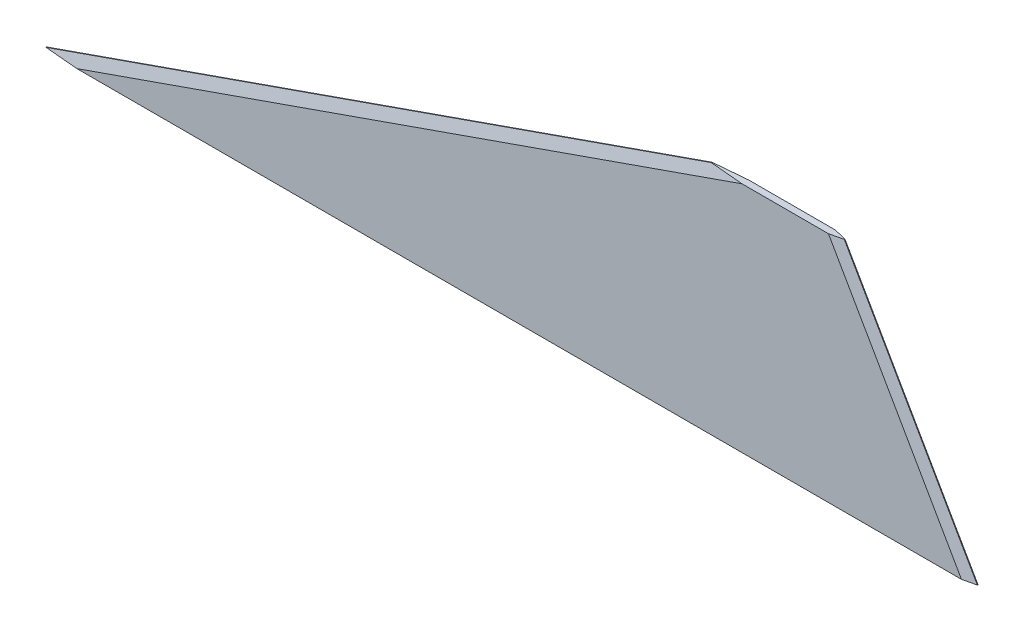
ISO-10303-21;
HEADER;
FILE_DESCRIPTION(('STEP AP214'),'2;1');
FILE_NAME('part.step','',(''),(''),'','','');
FILE_SCHEMA(('AUTOMOTIVE_DESIGN { 1 0 10303 214 1 1 1 1 }'));
ENDSEC;
DATA;
#1=APPLICATION_CONTEXT('core data for automotive mechanical design processes');
#2=APPLICATION_PROTOCOL_DEFINITION('international standard','automotive_design',2000,#1);
#3=PRODUCT_CONTEXT('',#1,'mechanical');
#4=PRODUCT('Part','Part','',(#3));
#5=PRODUCT_RELATED_PRODUCT_CATEGORY('part','',(#4));
#6=PRODUCT_DEFINITION_FORMATION('','',#4);
#7=PRODUCT_DEFINITION_CONTEXT('part definition',#1,'design');
#8=PRODUCT_DEFINITION('design','',#6,#7);
#9=PRODUCT_DEFINITION_SHAPE('','',#8);
#10=(LENGTH_UNIT() NAMED_UNIT(*) SI_UNIT(.MILLI.,.METRE.));
#11=(NAMED_UNIT(*) PLANE_ANGLE_UNIT() SI_UNIT($,.RADIAN.));
#12=(NAMED_UNIT(*) SI_UNIT($,.STERADIAN.) SOLID_ANGLE_UNIT());
#13=UNCERTAINTY_MEASURE_WITH_UNIT(LENGTH_MEASURE(1.E-05),#10,'distance_accuracy_value','');
#14=(GEOMETRIC_REPRESENTATION_CONTEXT(3) GLOBAL_UNCERTAINTY_ASSIGNED_CONTEXT((#13)) GLOBAL_UNIT_ASSIGNED_CONTEXT((#10,
#11,#12)) REPRESENTATION_CONTEXT('',''));
#15=CARTESIAN_POINT('',(0.,0.,0.));
#16=DIRECTION('',(0.,0.,1.));
#17=DIRECTION('',(1.,0.,0.));
#18=AXIS2_PLACEMENT_3D('',#15,#16,#17);
#19=CARTESIAN_POINT('',(254.,88.9,2.54));
#20=DIRECTION('',(0.330350424728106,-0.943858356366018,0.));
#21=DIRECTION('',(0.943858356366017,0.330350424728106,0.));
#22=AXIS2_PLACEMENT_3D('',#19,#20,#21);
#23=PLANE('',#22);
#24=DIRECTION('',(0.,0.,-1.));
#25=VECTOR('',#24,1.);
#26=CARTESIAN_POINT('',(254.,88.9,2.54));
#27=LINE('',#26,#25);
#28=CARTESIAN_POINT('',(254.,88.9,1.39699999999997));
#29=VERTEX_POINT('',#28);
#30=CARTESIAN_POINT('',(254.,88.9,1.14300000000002));
#31=VERTEX_POINT('',#30);
#32=EDGE_CURVE('E144',#29,#31,#27,.T.);
#33=ORIENTED_EDGE('',*,*,#32,.T.);
#34=DIRECTION('',(-0.943858356366017,-0.330350424728106,0.));
#35=VECTOR('',#34,1.);
#36=CARTESIAN_POINT('',(0.,0.,1.14300000000002));
#37=LINE('',#36,#35);
#38=CARTESIAN_POINT('',(0.,0.,1.14300000000002));
#39=VERTEX_POINT('',#38);
#40=EDGE_CURVE('E11',#31,#39,#37,.T.);
#41=ORIENTED_EDGE('',*,*,#40,.T.);
#42=DIRECTION('',(0.,0.,-1.));
#43=VECTOR('',#42,1.);
#44=CARTESIAN_POINT('',(0.,0.,2.54));
#45=LINE('',#44,#43);
#46=CARTESIAN_POINT('',(0.,0.,1.39699999999998));
#47=VERTEX_POINT('',#46);
#48=EDGE_CURVE('E132',#47,#39,#45,.T.);
#49=ORIENTED_EDGE('',*,*,#48,.F.);
#50=DIRECTION('',(0.943858356366017,0.330350424728106,0.));
#51=VECTOR('',#50,1.);
#52=CARTESIAN_POINT('',(254.,88.9,1.39699999999998));
#53=LINE('',#52,#51);
#54=EDGE_CURVE('E50',#47,#29,#53,.T.);
#55=ORIENTED_EDGE('',*,*,#54,.T.);
#56=EDGE_LOOP('',(#33,#41,#49,#55));
#57=FACE_BOUND('',#56,.T.);
#58=ADVANCED_FACE('F41',(#57),#23,.F.);
#59=CARTESIAN_POINT('',(0.,0.,2.54));
#60=DIRECTION('',(0.,1.,0.));
#61=DIRECTION('',(0.,0.,1.));
#62=AXIS2_PLACEMENT_3D('',#59,#60,#61);
#63=PLANE('',#62);
#64=DIRECTION('',(0.,0.,-1.));
#65=VECTOR('',#64,1.);
#66=CARTESIAN_POINT('',(355.6,0.,2.54));
#67=LINE('',#66,#65);
#68=CARTESIAN_POINT('',(355.6,0.,1.39700000000001));
#69=VERTEX_POINT('',#68);
#70=CARTESIAN_POINT('',(355.6,0.,1.14299999999999));
#71=VERTEX_POINT('',#70);
#72=EDGE_CURVE('E160',#69,#71,#67,.T.);
#73=ORIENTED_EDGE('',*,*,#72,.F.);
#74=DIRECTION('',(0.973989348035412,0.,-0.226593799371369));
#75=VECTOR('',#74,1.);
#76=CARTESIAN_POINT('',(268.796227621545,0.,21.5914678580679));
#77=LINE('',#76,#75);
#78=CARTESIAN_POINT('',(350.686936059624,0.,2.53999999999994));
#79=VERTEX_POINT('',#78);
#80=EDGE_CURVE('E137',#69,#79,#77,.F.);
#81=ORIENTED_EDGE('',*,*,#80,.T.);
#82=DIRECTION('',(1.,0.,0.));
#83=VECTOR('',#82,1.);
#84=CARTESIAN_POINT('',(0.,0.,2.54));
#85=LINE('',#84,#83);
#86=CARTESIAN_POINT('',(12.9127549224802,0.,2.54));
#87=VERTEX_POINT('',#86);
#88=EDGE_CURVE('E126',#87,#79,#85,.T.);
#89=ORIENTED_EDGE('',*,*,#88,.F.);
#90=DIRECTION('',(0.996105231462434,0.,0.0881723757940651));
#91=VECTOR('',#90,1.);
#92=CARTESIAN_POINT('',(1.49862003097463,0.,1.52965354339078));
#93=LINE('',#92,#91);
#94=EDGE_CURVE('E64',#87,#47,#93,.F.);
#95=ORIENTED_EDGE('',*,*,#94,.T.);
#96=ORIENTED_EDGE('',*,*,#48,.T.);
#97=DIRECTION('',(0.996105231462434,0.,-0.0881723757940651));
#98=VECTOR('',#97,1.);
#99=CARTESIAN_POINT('',(252.025310565295,0.,-21.1655570589307));
#100=LINE('',#99,#98);
#101=CARTESIAN_POINT('',(12.9127549224802,0.,0.));
#102=VERTEX_POINT('',#101);
#103=EDGE_CURVE('E57',#39,#102,#100,.T.);
#104=ORIENTED_EDGE('',*,*,#103,.T.);
#105=DIRECTION('',(1.,0.,0.));
#106=VECTOR('',#105,1.);
#107=CARTESIAN_POINT('',(0.,0.,0.));
#108=LINE('',#107,#106);
#109=CARTESIAN_POINT('',(350.686936059623,0.,0.));
#110=VERTEX_POINT('',#109);
#111=EDGE_CURVE('E148',#102,#110,#108,.T.);
#112=ORIENTED_EDGE('',*,*,#111,.T.);
#113=DIRECTION('',(0.973989348035412,0.,0.226593799371369));
#114=VECTOR('',#113,1.);
#115=CARTESIAN_POINT('',(355.6,0.,1.14299999999999));
#116=LINE('',#115,#114);
#117=EDGE_CURVE('E184',#110,#71,#116,.T.);
#118=ORIENTED_EDGE('',*,*,#117,.T.);
#119=EDGE_LOOP('',(#73,#81,#89,#95,#96,#104,#112,#118));
#120=FACE_BOUND('',#119,.T.);
#121=ADVANCED_FACE('F135',(#120),#63,.F.);
#122=CARTESIAN_POINT('',(355.6,0.,2.54));
#123=DIRECTION('',(-0.868243142124459,-0.496138938356834,0.));
#124=DIRECTION('',(0.496138938356834,-0.868243142124459,0.));
#125=AXIS2_PLACEMENT_3D('',#122,#123,#124);
#126=PLANE('',#125);
#127=DIRECTION('',(0.,0.,-1.));
#128=VECTOR('',#127,1.);
#129=CARTESIAN_POINT('',(304.8,88.9,2.54));
#130=LINE('',#129,#128);
#131=CARTESIAN_POINT('',(304.8,88.9,1.39700000000001));
#132=VERTEX_POINT('',#131);
#133=CARTESIAN_POINT('',(304.8,88.9,1.143));
#134=VERTEX_POINT('',#133);
#135=EDGE_CURVE('E156',#132,#134,#130,.T.);
#136=ORIENTED_EDGE('',*,*,#135,.F.);
#137=DIRECTION('',(0.496138938356834,-0.868243142124459,0.));
#138=VECTOR('',#137,1.);
#139=CARTESIAN_POINT('',(355.6,0.,1.39700000000001));
#140=LINE('',#139,#138);
#141=EDGE_CURVE('E119',#132,#69,#140,.T.);
#142=ORIENTED_EDGE('',*,*,#141,.T.);
#143=ORIENTED_EDGE('',*,*,#72,.T.);
#144=DIRECTION('',(-0.496138938356834,0.868243142124459,0.));
#145=VECTOR('',#144,1.);
#146=CARTESIAN_POINT('',(304.8,88.9,1.14299999999999));
#147=LINE('',#146,#145);
#148=EDGE_CURVE('E177',#71,#134,#147,.T.);
#149=ORIENTED_EDGE('',*,*,#148,.T.);
#150=EDGE_LOOP('',(#136,#142,#143,#149));
#151=FACE_BOUND('',#150,.T.);
#152=ADVANCED_FACE('F210',(#151),#126,.F.);
#153=CARTESIAN_POINT('',(304.8,88.9,2.54));
#154=DIRECTION('',(0.,-1.,0.));
#155=DIRECTION('',(1.,0.,0.));
#156=AXIS2_PLACEMENT_3D('',#153,#154,#155);
#157=PLANE('',#156);
#158=DIRECTION('',(-1.,0.,0.));
#159=VECTOR('',#158,1.);
#160=CARTESIAN_POINT('',(304.8,88.9,2.54));
#161=LINE('',#160,#159);
#162=CARTESIAN_POINT('',(299.886936059623,88.9,2.54000000000001));
#163=VERTEX_POINT('',#162);
#164=CARTESIAN_POINT('',(266.912754922476,88.9,2.53999999999983));
#165=VERTEX_POINT('',#164);
#166=EDGE_CURVE('E129',#163,#165,#161,.T.);
#167=ORIENTED_EDGE('',*,*,#166,.F.);
#168=DIRECTION('',(-0.973989348035412,0.,0.226593799371369));
#169=VECTOR('',#168,1.);
#170=CARTESIAN_POINT('',(266.187914325937,88.9,10.3799105546037));
#171=LINE('',#170,#169);
#172=EDGE_CURVE('E174',#163,#132,#171,.F.);
#173=ORIENTED_EDGE('',*,*,#172,.T.);
#174=ORIENTED_EDGE('',*,*,#135,.T.);
#175=DIRECTION('',(-0.973989348035412,0.,-0.226593799371369));
#176=VECTOR('',#175,1.);
#177=CARTESIAN_POINT('',(352.991686704391,88.9,12.3545573034642));
#178=LINE('',#177,#176);
#179=CARTESIAN_POINT('',(299.886936059623,88.9,0.));
#180=VERTEX_POINT('',#179);
#181=EDGE_CURVE('E171',#134,#180,#178,.T.);
#182=ORIENTED_EDGE('',*,*,#181,.T.);
#183=DIRECTION('',(-1.,0.,0.));
#184=VECTOR('',#183,1.);
#185=CARTESIAN_POINT('',(304.8,88.9,0.));
#186=LINE('',#185,#184);
#187=CARTESIAN_POINT('',(266.91275492248,88.9,0.));
#188=VERTEX_POINT('',#187);
#189=EDGE_CURVE('E139',#180,#188,#186,.T.);
#190=ORIENTED_EDGE('',*,*,#189,.T.);
#191=DIRECTION('',(-0.996105231462434,0.,0.0881723757940652));
#192=VECTOR('',#191,1.);
#193=CARTESIAN_POINT('',(254.,88.9,1.14300000000002));
#194=LINE('',#193,#192);
#195=EDGE_CURVE('E169',#188,#31,#194,.T.);
#196=ORIENTED_EDGE('',*,*,#195,.T.);
#197=ORIENTED_EDGE('',*,*,#32,.F.);
#198=DIRECTION('',(-0.996105231462434,0.,-0.0881723757940652));
#199=VECTOR('',#198,1.);
#200=CARTESIAN_POINT('',(3.47330946567979,88.9000000000001,-20.77890351554));
#201=LINE('',#200,#199);
#202=EDGE_CURVE('E166',#29,#165,#201,.F.);
#203=ORIENTED_EDGE('',*,*,#202,.T.);
#204=EDGE_LOOP('',(#167,#173,#174,#182,#190,#196,#197,#203));
#205=FACE_BOUND('',#204,.T.);
#206=ADVANCED_FACE('F196',(#205),#157,.F.);
#207=CARTESIAN_POINT('',(0.,0.,2.54));
#208=DIRECTION('',(0.,0.,-1.));
#209=DIRECTION('',(-1.,0.,0.));
#210=AXIS2_PLACEMENT_3D('',#207,#208,#209);
#211=PLANE('',#210);
#212=ORIENTED_EDGE('',*,*,#88,.T.);
#213=DIRECTION('',(-0.496138938356834,0.868243142124459,0.));
#214=VECTOR('',#213,1.);
#215=CARTESIAN_POINT('',(264.363997952639,151.065141687222,2.54));
#216=LINE('',#215,#214);
#217=EDGE_CURVE('E131',#79,#163,#216,.T.);
#218=ORIENTED_EDGE('',*,*,#217,.T.);
#219=ORIENTED_EDGE('',*,*,#166,.T.);
#220=DIRECTION('',(-0.943858356366018,-0.330350424728106,0.));
#221=VECTOR('',#220,1.);
#222=CARTESIAN_POINT('',(1.40918706280964,-4.0262487508847,2.54));
#223=LINE('',#222,#221);
#224=EDGE_CURVE('E118',#165,#87,#223,.T.);
#225=ORIENTED_EDGE('',*,*,#224,.T.);
#226=EDGE_LOOP('',(#212,#218,#219,#225));
#227=FACE_BOUND('',#226,.T.);
#228=ADVANCED_FACE('F124',(#227),#211,.F.);
#229=CARTESIAN_POINT('',(0.,0.,0.));
#230=DIRECTION('',(0.,0.,-1.));
#231=DIRECTION('',(-1.,0.,0.));
#232=AXIS2_PLACEMENT_3D('',#229,#230,#231);
#233=PLANE('',#232);
#234=ORIENTED_EDGE('',*,*,#189,.F.);
#235=DIRECTION('',(0.496138938356834,-0.868243142124459,0.));
#236=VECTOR('',#235,1.);
#237=CARTESIAN_POINT('',(351.896305644947,-2.1163967743162,0.));
#238=LINE('',#237,#236);
#239=EDGE_CURVE('E190',#180,#110,#238,.T.);
#240=ORIENTED_EDGE('',*,*,#239,.T.);
#241=ORIENTED_EDGE('',*,*,#111,.F.);
#242=DIRECTION('',(0.943858356366018,0.330350424728106,0.));
#243=VECTOR('',#242,1.);
#244=CARTESIAN_POINT('',(255.40918706281,84.8737512491153,0.));
#245=LINE('',#244,#243);
#246=EDGE_CURVE('E187',#102,#188,#245,.T.);
#247=ORIENTED_EDGE('',*,*,#246,.T.);
#248=EDGE_LOOP('',(#234,#240,#241,#247));
#249=FACE_BOUND('',#248,.T.);
#250=ADVANCED_FACE('F203',(#249),#233,.T.);
#251=CARTESIAN_POINT('',(264.363997952639,151.065141687222,2.54));
#252=DIRECTION('',(-0.224717860961465,-0.128410206263694,-0.965925826289068));
#253=DIRECTION('',(-0.496138938356834,0.868243142124459,0.));
#254=AXIS2_PLACEMENT_3D('',#251,#252,#253);
#255=PLANE('',#254);
#256=ORIENTED_EDGE('',*,*,#80,.F.);
#257=ORIENTED_EDGE('',*,*,#141,.F.);
#258=ORIENTED_EDGE('',*,*,#172,.F.);
#259=ORIENTED_EDGE('',*,*,#217,.F.);
#260=EDGE_LOOP('',(#256,#257,#258,#259));
#261=FACE_BOUND('',#260,.T.);
#262=ADVANCED_FACE('F213',(#261),#255,.F.);
#263=CARTESIAN_POINT('',(355.6,0.,1.14299999999999));
#264=DIRECTION('',(0.224717860961465,0.128410206263694,-0.965925826289068));
#265=DIRECTION('',(0.496138938356834,-0.868243142124459,0.));
#266=AXIS2_PLACEMENT_3D('',#263,#264,#265);
#267=PLANE('',#266);
#268=ORIENTED_EDGE('',*,*,#117,.F.);
#269=ORIENTED_EDGE('',*,*,#239,.F.);
#270=ORIENTED_EDGE('',*,*,#181,.F.);
#271=ORIENTED_EDGE('',*,*,#148,.F.);
#272=EDGE_LOOP('',(#268,#269,#270,#271));
#273=FACE_BOUND('',#272,.T.);
#274=ADVANCED_FACE('F206',(#273),#267,.T.);
#275=CARTESIAN_POINT('',(254.,88.9,1.14300000000002));
#276=DIRECTION('',(-0.0855009814773414,0.24428851850669,-0.965925826289068));
#277=DIRECTION('',(0.943858356366017,0.330350424728106,0.));
#278=AXIS2_PLACEMENT_3D('',#275,#276,#277);
#279=PLANE('',#278);
#280=ORIENTED_EDGE('',*,*,#195,.F.);
#281=ORIENTED_EDGE('',*,*,#246,.F.);
#282=ORIENTED_EDGE('',*,*,#103,.F.);
#283=ORIENTED_EDGE('',*,*,#40,.F.);
#284=EDGE_LOOP('',(#280,#281,#282,#283));
#285=FACE_BOUND('',#284,.T.);
#286=ADVANCED_FACE('F199',(#285),#279,.T.);
#287=CARTESIAN_POINT('',(1.40918706280964,-4.0262487508847,2.54));
#288=DIRECTION('',(0.0855009814773414,-0.24428851850669,-0.965925826289068));
#289=DIRECTION('',(-0.943858356366017,-0.330350424728106,0.));
#290=AXIS2_PLACEMENT_3D('',#287,#288,#289);
#291=PLANE('',#290);
#292=ORIENTED_EDGE('',*,*,#202,.F.);
#293=ORIENTED_EDGE('',*,*,#54,.F.);
#294=ORIENTED_EDGE('',*,*,#94,.F.);
#295=ORIENTED_EDGE('',*,*,#224,.F.);
#296=EDGE_LOOP('',(#292,#293,#294,#295));
#297=FACE_BOUND('',#296,.T.);
#298=ADVANCED_FACE('F43',(#297),#291,.F.);
#299=CLOSED_SHELL('',(#58,#121,#152,#206,#228,#250,#262,#274,#286,#298));
#300=MANIFOLD_SOLID_BREP('B2',#299);
#301=ADVANCED_BREP_SHAPE_REPRESENTATION('',(#18,#300),#14);
#302=SHAPE_DEFINITION_REPRESENTATION(#9,#301);
ENDSEC;
END-ISO-10303-21;
